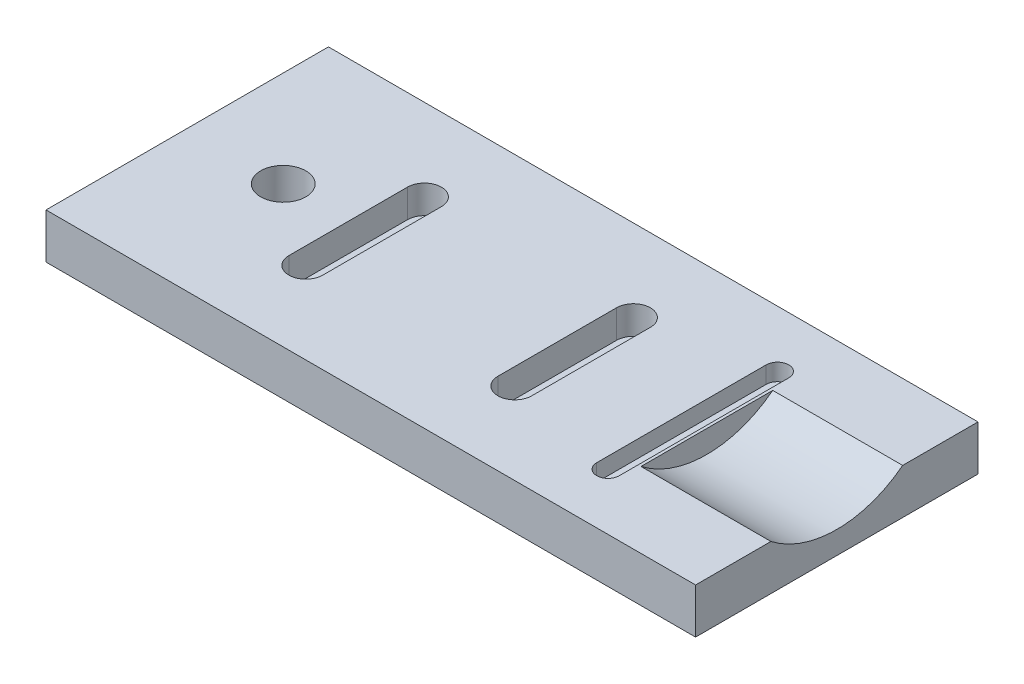
ISO-10303-21;
HEADER;
FILE_DESCRIPTION(('STEP AP214'),'2;1');
FILE_NAME('part.step','',(''),(''),'','','');
FILE_SCHEMA(('AUTOMOTIVE_DESIGN { 1 0 10303 214 1 1 1 1 }'));
ENDSEC;
DATA;
#1=APPLICATION_CONTEXT('core data for automotive mechanical design processes');
#2=APPLICATION_PROTOCOL_DEFINITION('international standard','automotive_design',2000,#1);
#3=PRODUCT_CONTEXT('',#1,'mechanical');
#4=PRODUCT('Part','Part','',(#3));
#5=PRODUCT_RELATED_PRODUCT_CATEGORY('part','',(#4));
#6=PRODUCT_DEFINITION_FORMATION('','',#4);
#7=PRODUCT_DEFINITION_CONTEXT('part definition',#1,'design');
#8=PRODUCT_DEFINITION('design','',#6,#7);
#9=PRODUCT_DEFINITION_SHAPE('','',#8);
#10=(LENGTH_UNIT() NAMED_UNIT(*) SI_UNIT(.MILLI.,.METRE.));
#11=(NAMED_UNIT(*) PLANE_ANGLE_UNIT() SI_UNIT($,.RADIAN.));
#12=(NAMED_UNIT(*) SI_UNIT($,.STERADIAN.) SOLID_ANGLE_UNIT());
#13=UNCERTAINTY_MEASURE_WITH_UNIT(LENGTH_MEASURE(1.E-05),#10,'distance_accuracy_value','');
#14=(GEOMETRIC_REPRESENTATION_CONTEXT(3) GLOBAL_UNCERTAINTY_ASSIGNED_CONTEXT((#13)) GLOBAL_UNIT_ASSIGNED_CONTEXT((#10,
#11,#12)) REPRESENTATION_CONTEXT('',''));
#15=CARTESIAN_POINT('',(0.,0.,0.));
#16=DIRECTION('',(0.,0.,1.));
#17=DIRECTION('',(1.,0.,0.));
#18=AXIS2_PLACEMENT_3D('',#15,#16,#17);
#19=CARTESIAN_POINT('',(57.5,8.,25.));
#20=DIRECTION('',(-1.,0.,0.));
#21=DIRECTION('',(0.,0.,1.));
#22=AXIS2_PLACEMENT_3D('',#19,#20,#21);
#23=PLANE('',#22);
#24=DIRECTION('',(0.,0.,-1.));
#25=VECTOR('',#24,1.);
#26=CARTESIAN_POINT('',(57.5,8.,25.));
#27=LINE('',#26,#25);
#28=CARTESIAN_POINT('',(57.5,8.,-11.6619037896906));
#29=VERTEX_POINT('',#28);
#30=CARTESIAN_POINT('',(57.5,8.,-25.));
#31=VERTEX_POINT('',#30);
#32=EDGE_CURVE('E442',#29,#31,#27,.T.);
#33=ORIENTED_EDGE('',*,*,#32,.F.);
#34=CARTESIAN_POINT('',(57.5,23.,0.));
#35=DIRECTION('',(1.,0.,0.));
#36=DIRECTION('',(0.,0.,-1.));
#37=AXIS2_PLACEMENT_3D('',#34,#35,#36);
#38=CIRCLE('',#37,19.);
#39=CARTESIAN_POINT('',(57.5,8.00000000000001,11.6619037896906));
#40=VERTEX_POINT('',#39);
#41=EDGE_CURVE('E316',#40,#29,#38,.T.);
#42=ORIENTED_EDGE('',*,*,#41,.F.);
#43=CARTESIAN_POINT('',(57.5,8.,25.));
#44=VERTEX_POINT('',#43);
#45=EDGE_CURVE('E438',#44,#40,#27,.T.);
#46=ORIENTED_EDGE('',*,*,#45,.F.);
#47=DIRECTION('',(0.,-1.,0.));
#48=VECTOR('',#47,1.);
#49=CARTESIAN_POINT('',(57.5,8.,25.));
#50=LINE('',#49,#48);
#51=CARTESIAN_POINT('',(57.5,0.,25.));
#52=VERTEX_POINT('',#51);
#53=EDGE_CURVE('E448',#44,#52,#50,.T.);
#54=ORIENTED_EDGE('',*,*,#53,.T.);
#55=DIRECTION('',(0.,0.,-1.));
#56=VECTOR('',#55,1.);
#57=CARTESIAN_POINT('',(57.5,0.,25.));
#58=LINE('',#57,#56);
#59=CARTESIAN_POINT('',(57.5,0.,-25.));
#60=VERTEX_POINT('',#59);
#61=EDGE_CURVE('E449',#52,#60,#58,.T.);
#62=ORIENTED_EDGE('',*,*,#61,.T.);
#63=DIRECTION('',(0.,-1.,0.));
#64=VECTOR('',#63,1.);
#65=CARTESIAN_POINT('',(57.5,8.,-25.));
#66=LINE('',#65,#64);
#67=EDGE_CURVE('E41',#31,#60,#66,.T.);
#68=ORIENTED_EDGE('',*,*,#67,.F.);
#69=EDGE_LOOP('',(#33,#42,#46,#54,#62,#68));
#70=FACE_BOUND('',#69,.T.);
#71=ADVANCED_FACE('F34',(#70),#23,.F.);
#72=CARTESIAN_POINT('',(-57.5,8.,-25.));
#73=DIRECTION('',(0.,0.,1.));
#74=DIRECTION('',(1.,0.,0.));
#75=AXIS2_PLACEMENT_3D('',#72,#73,#74);
#76=PLANE('',#75);
#77=DIRECTION('',(-1.,0.,0.));
#78=VECTOR('',#77,1.);
#79=CARTESIAN_POINT('',(-57.5,0.,-25.));
#80=LINE('',#79,#78);
#81=CARTESIAN_POINT('',(-57.5,0.,-25.));
#82=VERTEX_POINT('',#81);
#83=EDGE_CURVE('E452',#60,#82,#80,.T.);
#84=ORIENTED_EDGE('',*,*,#83,.T.);
#85=DIRECTION('',(0.,-1.,0.));
#86=VECTOR('',#85,1.);
#87=CARTESIAN_POINT('',(-57.5,8.,-25.));
#88=LINE('',#87,#86);
#89=CARTESIAN_POINT('',(-57.5,8.,-25.));
#90=VERTEX_POINT('',#89);
#91=EDGE_CURVE('E463',#90,#82,#88,.T.);
#92=ORIENTED_EDGE('',*,*,#91,.F.);
#93=DIRECTION('',(-1.,0.,0.));
#94=VECTOR('',#93,1.);
#95=CARTESIAN_POINT('',(-57.5,8.,-25.));
#96=LINE('',#95,#94);
#97=EDGE_CURVE('E441',#31,#90,#96,.T.);
#98=ORIENTED_EDGE('',*,*,#97,.F.);
#99=ORIENTED_EDGE('',*,*,#67,.T.);
#100=EDGE_LOOP('',(#84,#92,#98,#99));
#101=FACE_BOUND('',#100,.T.);
#102=ADVANCED_FACE('F498',(#101),#76,.F.);
#103=CARTESIAN_POINT('',(-57.5,8.,25.));
#104=DIRECTION('',(1.,0.,0.));
#105=DIRECTION('',(0.,0.,-1.));
#106=AXIS2_PLACEMENT_3D('',#103,#104,#105);
#107=PLANE('',#106);
#108=DIRECTION('',(0.,0.,1.));
#109=VECTOR('',#108,1.);
#110=CARTESIAN_POINT('',(-57.5,0.,25.));
#111=LINE('',#110,#109);
#112=CARTESIAN_POINT('',(-57.5,0.,25.));
#113=VERTEX_POINT('',#112);
#114=EDGE_CURVE('E454',#82,#113,#111,.T.);
#115=ORIENTED_EDGE('',*,*,#114,.T.);
#116=DIRECTION('',(0.,-1.,0.));
#117=VECTOR('',#116,1.);
#118=CARTESIAN_POINT('',(-57.5,8.,25.));
#119=LINE('',#118,#117);
#120=CARTESIAN_POINT('',(-57.5,8.,25.));
#121=VERTEX_POINT('',#120);
#122=EDGE_CURVE('E460',#121,#113,#119,.T.);
#123=ORIENTED_EDGE('',*,*,#122,.F.);
#124=DIRECTION('',(0.,0.,1.));
#125=VECTOR('',#124,1.);
#126=CARTESIAN_POINT('',(-57.5,8.,25.));
#127=LINE('',#126,#125);
#128=EDGE_CURVE('E444',#90,#121,#127,.T.);
#129=ORIENTED_EDGE('',*,*,#128,.F.);
#130=ORIENTED_EDGE('',*,*,#91,.T.);
#131=EDGE_LOOP('',(#115,#123,#129,#130));
#132=FACE_BOUND('',#131,.T.);
#133=ADVANCED_FACE('F494',(#132),#107,.F.);
#134=CARTESIAN_POINT('',(-57.5,8.,25.));
#135=DIRECTION('',(0.,0.,-1.));
#136=DIRECTION('',(-1.,0.,0.));
#137=AXIS2_PLACEMENT_3D('',#134,#135,#136);
#138=PLANE('',#137);
#139=DIRECTION('',(1.,0.,0.));
#140=VECTOR('',#139,1.);
#141=CARTESIAN_POINT('',(-57.5,0.,25.));
#142=LINE('',#141,#140);
#143=EDGE_CURVE('E456',#113,#52,#142,.T.);
#144=ORIENTED_EDGE('',*,*,#143,.T.);
#145=ORIENTED_EDGE('',*,*,#53,.F.);
#146=DIRECTION('',(1.,0.,0.));
#147=VECTOR('',#146,1.);
#148=CARTESIAN_POINT('',(-57.5,8.,25.));
#149=LINE('',#148,#147);
#150=EDGE_CURVE('E446',#121,#44,#149,.T.);
#151=ORIENTED_EDGE('',*,*,#150,.F.);
#152=ORIENTED_EDGE('',*,*,#122,.T.);
#153=EDGE_LOOP('',(#144,#145,#151,#152));
#154=FACE_BOUND('',#153,.T.);
#155=ADVANCED_FACE('F490',(#154),#138,.F.);
#156=CARTESIAN_POINT('',(0.,8.,0.));
#157=DIRECTION('',(0.,-1.,0.));
#158=DIRECTION('',(0.,0.,-1.));
#159=AXIS2_PLACEMENT_3D('',#156,#157,#158);
#160=PLANE('',#159);
#161=DIRECTION('',(0.,0.,1.));
#162=VECTOR('',#161,1.);
#163=CARTESIAN_POINT('',(30.,8.,-15.));
#164=LINE('',#163,#162);
#165=CARTESIAN_POINT('',(30.,8.,-15.));
#166=VERTEX_POINT('',#165);
#167=CARTESIAN_POINT('',(30.,8.,15.));
#168=VERTEX_POINT('',#167);
#169=EDGE_CURVE('E354',#166,#168,#164,.T.);
#170=ORIENTED_EDGE('',*,*,#169,.F.);
#171=CARTESIAN_POINT('',(32.,8.,-15.));
#172=DIRECTION('',(0.,1.,0.));
#173=DIRECTION('',(0.,0.,1.));
#174=AXIS2_PLACEMENT_3D('',#171,#172,#173);
#175=CIRCLE('',#174,2.);
#176=CARTESIAN_POINT('',(34.,8.,-15.));
#177=VERTEX_POINT('',#176);
#178=EDGE_CURVE('E337',#177,#166,#175,.T.);
#179=ORIENTED_EDGE('',*,*,#178,.F.);
#180=DIRECTION('',(0.,0.,-1.));
#181=VECTOR('',#180,1.);
#182=CARTESIAN_POINT('',(34.,8.,-15.));
#183=LINE('',#182,#181);
#184=CARTESIAN_POINT('',(34.,8.,15.));
#185=VERTEX_POINT('',#184);
#186=EDGE_CURVE('E343',#185,#177,#183,.T.);
#187=ORIENTED_EDGE('',*,*,#186,.F.);
#188=CARTESIAN_POINT('',(32.,8.,15.));
#189=DIRECTION('',(0.,1.,0.));
#190=DIRECTION('',(0.,0.,1.));
#191=AXIS2_PLACEMENT_3D('',#188,#189,#190);
#192=CIRCLE('',#191,2.);
#193=EDGE_CURVE('E357',#168,#185,#192,.T.);
#194=ORIENTED_EDGE('',*,*,#193,.F.);
#195=EDGE_LOOP('',(#170,#179,#187,#194));
#196=FACE_BOUND('',#195,.T.);
#197=DIRECTION('',(0.,0.,1.));
#198=VECTOR('',#197,1.);
#199=CARTESIAN_POINT('',(7.99999999999999,8.,10.5));
#200=LINE('',#199,#198);
#201=CARTESIAN_POINT('',(7.99999999999999,8.,-10.5));
#202=VERTEX_POINT('',#201);
#203=CARTESIAN_POINT('',(7.99999999999999,8.,10.5));
#204=VERTEX_POINT('',#203);
#205=EDGE_CURVE('E386',#202,#204,#200,.T.);
#206=ORIENTED_EDGE('',*,*,#205,.F.);
#207=CARTESIAN_POINT('',(11.,8.,-10.5));
#208=DIRECTION('',(0.,1.,0.));
#209=DIRECTION('',(0.,0.,-1.));
#210=AXIS2_PLACEMENT_3D('',#207,#208,#209);
#211=CIRCLE('',#210,3.);
#212=CARTESIAN_POINT('',(14.,8.,-10.5));
#213=VERTEX_POINT('',#212);
#214=EDGE_CURVE('E364',#213,#202,#211,.T.);
#215=ORIENTED_EDGE('',*,*,#214,.F.);
#216=DIRECTION('',(0.,0.,-1.));
#217=VECTOR('',#216,1.);
#218=CARTESIAN_POINT('',(14.,8.,10.5));
#219=LINE('',#218,#217);
#220=CARTESIAN_POINT('',(14.,8.,10.5));
#221=VERTEX_POINT('',#220);
#222=EDGE_CURVE('E375',#221,#213,#219,.T.);
#223=ORIENTED_EDGE('',*,*,#222,.F.);
#224=CARTESIAN_POINT('',(11.,8.,10.5));
#225=DIRECTION('',(0.,1.,0.));
#226=DIRECTION('',(0.,0.,1.));
#227=AXIS2_PLACEMENT_3D('',#224,#225,#226);
#228=CIRCLE('',#227,3.);
#229=EDGE_CURVE('E389',#204,#221,#228,.T.);
#230=ORIENTED_EDGE('',*,*,#229,.F.);
#231=EDGE_LOOP('',(#206,#215,#223,#230));
#232=FACE_BOUND('',#231,.T.);
#233=DIRECTION('',(0.,0.,1.));
#234=VECTOR('',#233,1.);
#235=CARTESIAN_POINT('',(-29.,8.,10.5));
#236=LINE('',#235,#234);
#237=CARTESIAN_POINT('',(-29.,8.,-10.5));
#238=VERTEX_POINT('',#237);
#239=CARTESIAN_POINT('',(-29.,8.,10.5));
#240=VERTEX_POINT('',#239);
#241=EDGE_CURVE('E418',#238,#240,#236,.T.);
#242=ORIENTED_EDGE('',*,*,#241,.F.);
#243=CARTESIAN_POINT('',(-26.,8.,-10.5));
#244=DIRECTION('',(0.,1.,0.));
#245=DIRECTION('',(0.,0.,-1.));
#246=AXIS2_PLACEMENT_3D('',#243,#244,#245);
#247=CIRCLE('',#246,3.);
#248=CARTESIAN_POINT('',(-23.,8.,-10.5));
#249=VERTEX_POINT('',#248);
#250=EDGE_CURVE('E396',#249,#238,#247,.T.);
#251=ORIENTED_EDGE('',*,*,#250,.F.);
#252=DIRECTION('',(0.,0.,-1.));
#253=VECTOR('',#252,1.);
#254=CARTESIAN_POINT('',(-23.,8.,10.5));
#255=LINE('',#254,#253);
#256=CARTESIAN_POINT('',(-23.,8.,10.5));
#257=VERTEX_POINT('',#256);
#258=EDGE_CURVE('E407',#257,#249,#255,.T.);
#259=ORIENTED_EDGE('',*,*,#258,.F.);
#260=CARTESIAN_POINT('',(-26.,8.,10.5));
#261=DIRECTION('',(0.,1.,0.));
#262=DIRECTION('',(0.,0.,1.));
#263=AXIS2_PLACEMENT_3D('',#260,#261,#262);
#264=CIRCLE('',#263,3.);
#265=EDGE_CURVE('E421',#240,#257,#264,.T.);
#266=ORIENTED_EDGE('',*,*,#265,.F.);
#267=EDGE_LOOP('',(#242,#251,#259,#266));
#268=FACE_BOUND('',#267,.T.);
#269=CARTESIAN_POINT('',(-40.5,8.,0.));
#270=DIRECTION('',(0.,1.,0.));
#271=DIRECTION('',(0.,0.,1.));
#272=AXIS2_PLACEMENT_3D('',#269,#270,#271);
#273=CIRCLE('',#272,4.00000000000001);
#274=CARTESIAN_POINT('',(-40.5,8.,4.00000000000001));
#275=VERTEX_POINT('',#274);
#276=EDGE_CURVE('E428',#275,#275,#273,.T.);
#277=ORIENTED_EDGE('',*,*,#276,.F.);
#278=EDGE_LOOP('',(#277));
#279=FACE_BOUND('',#278,.T.);
#280=DIRECTION('',(0.,0.,1.));
#281=VECTOR('',#280,1.);
#282=CARTESIAN_POINT('',(34.5,8.,0.));
#283=LINE('',#282,#281);
#284=CARTESIAN_POINT('',(34.5,8.,-11.6619037896906));
#285=VERTEX_POINT('',#284);
#286=CARTESIAN_POINT('',(34.5,8.00000000000001,11.6619037896906));
#287=VERTEX_POINT('',#286);
#288=EDGE_CURVE('E11',#285,#287,#283,.T.);
#289=ORIENTED_EDGE('',*,*,#288,.F.);
#290=DIRECTION('',(1.,0.,0.));
#291=VECTOR('',#290,1.);
#292=CARTESIAN_POINT('',(34.5,8.,-11.6619037896906));
#293=LINE('',#292,#291);
#294=EDGE_CURVE('E334',#285,#29,#293,.T.);
#295=ORIENTED_EDGE('',*,*,#294,.T.);
#296=ORIENTED_EDGE('',*,*,#32,.T.);
#297=ORIENTED_EDGE('',*,*,#97,.T.);
#298=ORIENTED_EDGE('',*,*,#128,.T.);
#299=ORIENTED_EDGE('',*,*,#150,.T.);
#300=ORIENTED_EDGE('',*,*,#45,.T.);
#301=DIRECTION('',(1.,0.,0.));
#302=VECTOR('',#301,1.);
#303=CARTESIAN_POINT('',(34.5,8.00000000000001,11.6619037896906));
#304=LINE('',#303,#302);
#305=EDGE_CURVE('E332',#287,#40,#304,.T.);
#306=ORIENTED_EDGE('',*,*,#305,.F.);
#307=EDGE_LOOP('',(#289,#295,#296,#297,#298,#299,#300,#306));
#308=FACE_BOUND('',#307,.T.);
#309=ADVANCED_FACE('F476',(#196,#232,#268,#279,#308),#160,.F.);
#310=CARTESIAN_POINT('',(0.,0.,0.));
#311=DIRECTION('',(0.,-1.,0.));
#312=DIRECTION('',(0.,0.,-1.));
#313=AXIS2_PLACEMENT_3D('',#310,#311,#312);
#314=PLANE('',#313);
#315=CARTESIAN_POINT('',(0.985281374238635,0.,8.48528137423849));
#316=DIRECTION('',(0.,-1.,0.));
#317=DIRECTION('',(0.,0.,-1.));
#318=AXIS2_PLACEMENT_3D('',#315,#316,#317);
#319=CIRCLE('',#318,2.);
#320=CARTESIAN_POINT('',(-0.428932188134473,0.,7.07106781186541));
#321=VERTEX_POINT('',#320);
#322=CARTESIAN_POINT('',(2.39949493661174,0.,9.89949493661157));
#323=VERTEX_POINT('',#322);
#324=EDGE_CURVE('E48',#321,#323,#319,.T.);
#325=ORIENTED_EDGE('',*,*,#324,.F.);
#326=CARTESIAN_POINT('',(-7.50000000000001,0.,0.));
#327=DIRECTION('',(0.,1.,0.));
#328=DIRECTION('',(0.,0.,-1.));
#329=AXIS2_PLACEMENT_3D('',#326,#327,#328);
#330=CIRCLE('',#329,10.);
#331=CARTESIAN_POINT('',(-7.50000000000001,0.,-10.));
#332=VERTEX_POINT('',#331);
#333=EDGE_CURVE('E249',#332,#321,#330,.T.);
#334=ORIENTED_EDGE('',*,*,#333,.F.);
#335=CARTESIAN_POINT('',(-7.50000000000001,0.,-12.));
#336=DIRECTION('',(0.,-1.,0.));
#337=DIRECTION('',(0.,0.,-1.));
#338=AXIS2_PLACEMENT_3D('',#335,#336,#337);
#339=CIRCLE('',#338,2.);
#340=CARTESIAN_POINT('',(-7.50000000000001,0.,-14.));
#341=VERTEX_POINT('',#340);
#342=EDGE_CURVE('E252',#341,#332,#339,.T.);
#343=ORIENTED_EDGE('',*,*,#342,.F.);
#344=CARTESIAN_POINT('',(-7.50000000000001,0.,0.));
#345=DIRECTION('',(0.,-1.,0.));
#346=DIRECTION('',(0.,0.,-1.));
#347=AXIS2_PLACEMENT_3D('',#344,#345,#346);
#348=CIRCLE('',#347,14.);
#349=EDGE_CURVE('E258',#323,#341,#348,.T.);
#350=ORIENTED_EDGE('',*,*,#349,.F.);
#351=EDGE_LOOP('',(#325,#334,#343,#350));
#352=FACE_BOUND('',#351,.T.);
#353=CARTESIAN_POINT('',(-9.36613448086307,0.,-1.86613448086306));
#354=DIRECTION('',(0.,-1.,0.));
#355=DIRECTION('',(0.,0.,-1.));
#356=AXIS2_PLACEMENT_3D('',#353,#354,#355);
#357=CIRCLE('',#356,1.5);
#358=CARTESIAN_POINT('',(-10.75,0.,-1.2874150108745));
#359=VERTEX_POINT('',#358);
#360=CARTESIAN_POINT('',(-8.78741501087451,0.,-3.25));
#361=VERTEX_POINT('',#360);
#362=EDGE_CURVE('E56',#359,#361,#357,.T.);
#363=ORIENTED_EDGE('',*,*,#362,.F.);
#364=DIRECTION('',(0.,0.,-1.));
#365=VECTOR('',#364,1.);
#366=CARTESIAN_POINT('',(-10.75,0.,1.2874150108745));
#367=LINE('',#366,#365);
#368=CARTESIAN_POINT('',(-10.75,0.,1.2874150108745));
#369=VERTEX_POINT('',#368);
#370=EDGE_CURVE('E271',#369,#359,#367,.T.);
#371=ORIENTED_EDGE('',*,*,#370,.F.);
#372=CARTESIAN_POINT('',(-9.36613448086307,0.,1.86613448086305));
#373=DIRECTION('',(0.,-1.,0.));
#374=DIRECTION('',(0.,0.,-1.));
#375=AXIS2_PLACEMENT_3D('',#372,#373,#374);
#376=CIRCLE('',#375,1.5);
#377=CARTESIAN_POINT('',(-8.78741501087451,0.,3.25));
#378=VERTEX_POINT('',#377);
#379=EDGE_CURVE('E309',#378,#369,#376,.T.);
#380=ORIENTED_EDGE('',*,*,#379,.F.);
#381=DIRECTION('',(-1.,0.,0.));
#382=VECTOR('',#381,1.);
#383=CARTESIAN_POINT('',(-8.78741501087451,0.,3.25));
#384=LINE('',#383,#382);
#385=CARTESIAN_POINT('',(-6.21258498912551,0.,3.25));
#386=VERTEX_POINT('',#385);
#387=EDGE_CURVE('E306',#386,#378,#384,.T.);
#388=ORIENTED_EDGE('',*,*,#387,.F.);
#389=CARTESIAN_POINT('',(-5.63386551913696,0.,1.86613448086305));
#390=DIRECTION('',(0.,-1.,0.));
#391=DIRECTION('',(0.,0.,-1.));
#392=AXIS2_PLACEMENT_3D('',#389,#390,#391);
#393=CIRCLE('',#392,1.5);
#394=CARTESIAN_POINT('',(-4.25000000000001,0.,1.2874150108745));
#395=VERTEX_POINT('',#394);
#396=EDGE_CURVE('E303',#395,#386,#393,.T.);
#397=ORIENTED_EDGE('',*,*,#396,.F.);
#398=DIRECTION('',(0.,0.,1.));
#399=VECTOR('',#398,1.);
#400=CARTESIAN_POINT('',(-4.25000000000001,0.,1.2874150108745));
#401=LINE('',#400,#399);
#402=CARTESIAN_POINT('',(-4.25000000000001,0.,-1.2874150108745));
#403=VERTEX_POINT('',#402);
#404=EDGE_CURVE('E300',#403,#395,#401,.T.);
#405=ORIENTED_EDGE('',*,*,#404,.F.);
#406=CARTESIAN_POINT('',(-5.63386551913696,0.,-1.86613448086306));
#407=DIRECTION('',(0.,-1.,0.));
#408=DIRECTION('',(0.,0.,-1.));
#409=AXIS2_PLACEMENT_3D('',#406,#407,#408);
#410=CIRCLE('',#409,1.5);
#411=CARTESIAN_POINT('',(-6.21258498912551,0.,-3.25));
#412=VERTEX_POINT('',#411);
#413=EDGE_CURVE('E297',#412,#403,#410,.T.);
#414=ORIENTED_EDGE('',*,*,#413,.F.);
#415=DIRECTION('',(1.,0.,0.));
#416=VECTOR('',#415,1.);
#417=CARTESIAN_POINT('',(-8.78741501087451,0.,-3.25));
#418=LINE('',#417,#416);
#419=EDGE_CURVE('E294',#361,#412,#418,.T.);
#420=ORIENTED_EDGE('',*,*,#419,.F.);
#421=EDGE_LOOP('',(#363,#371,#380,#388,#397,#405,#414,#420));
#422=FACE_BOUND('',#421,.T.);
#423=CARTESIAN_POINT('',(-40.5,0.,0.));
#424=DIRECTION('',(0.,-1.,0.));
#425=DIRECTION('',(0.,0.,-1.));
#426=AXIS2_PLACEMENT_3D('',#423,#424,#425);
#427=CIRCLE('',#426,4.00000000000001);
#428=CARTESIAN_POINT('',(-40.5,0.,-4.00000000000001));
#429=VERTEX_POINT('',#428);
#430=EDGE_CURVE('E437',#429,#429,#427,.T.);
#431=ORIENTED_EDGE('',*,*,#430,.F.);
#432=EDGE_LOOP('',(#431));
#433=FACE_BOUND('',#432,.T.);
#434=ORIENTED_EDGE('',*,*,#61,.F.);
#435=ORIENTED_EDGE('',*,*,#143,.F.);
#436=ORIENTED_EDGE('',*,*,#114,.F.);
#437=ORIENTED_EDGE('',*,*,#83,.F.);
#438=EDGE_LOOP('',(#434,#435,#436,#437));
#439=FACE_BOUND('',#438,.T.);
#440=ADVANCED_FACE('F473',(#352,#422,#433,#439),#314,.T.);
#441=CARTESIAN_POINT('',(-40.5,-2.,0.));
#442=DIRECTION('',(0.,1.,0.));
#443=DIRECTION('',(0.,0.,1.));
#444=AXIS2_PLACEMENT_3D('',#441,#442,#443);
#445=CYLINDRICAL_SURFACE('',#444,4.00000000000001);
#446=ORIENTED_EDGE('',*,*,#430,.T.);
#447=EDGE_LOOP('',(#446));
#448=FACE_BOUND('',#447,.T.);
#449=ORIENTED_EDGE('',*,*,#276,.T.);
#450=EDGE_LOOP('',(#449));
#451=FACE_BOUND('',#450,.T.);
#452=ADVANCED_FACE('F470',(#448,#451),#445,.F.);
#453=CARTESIAN_POINT('',(-26.,3.,-10.5));
#454=DIRECTION('',(0.,1.,0.));
#455=DIRECTION('',(0.,0.,1.));
#456=AXIS2_PLACEMENT_3D('',#453,#454,#455);
#457=CYLINDRICAL_SURFACE('',#456,3.);
#458=ORIENTED_EDGE('',*,*,#250,.T.);
#459=DIRECTION('',(0.,1.,0.));
#460=VECTOR('',#459,1.);
#461=CARTESIAN_POINT('',(-29.,3.,-10.5));
#462=LINE('',#461,#460);
#463=CARTESIAN_POINT('',(-29.,3.,-10.5));
#464=VERTEX_POINT('',#463);
#465=EDGE_CURVE('E416',#464,#238,#462,.T.);
#466=ORIENTED_EDGE('',*,*,#465,.F.);
#467=CARTESIAN_POINT('',(-26.,3.,-10.5));
#468=DIRECTION('',(0.,1.,0.));
#469=DIRECTION('',(0.,0.,-1.));
#470=AXIS2_PLACEMENT_3D('',#467,#468,#469);
#471=CIRCLE('',#470,3.);
#472=CARTESIAN_POINT('',(-23.,3.,-10.5));
#473=VERTEX_POINT('',#472);
#474=EDGE_CURVE('E403',#473,#464,#471,.T.);
#475=ORIENTED_EDGE('',*,*,#474,.F.);
#476=DIRECTION('',(0.,1.,0.));
#477=VECTOR('',#476,1.);
#478=CARTESIAN_POINT('',(-23.,3.,-10.5));
#479=LINE('',#478,#477);
#480=EDGE_CURVE('E426',#473,#249,#479,.T.);
#481=ORIENTED_EDGE('',*,*,#480,.T.);
#482=EDGE_LOOP('',(#458,#466,#475,#481));
#483=FACE_BOUND('',#482,.T.);
#484=ADVANCED_FACE('F537',(#483),#457,.F.);
#485=CARTESIAN_POINT('',(-23.,3.,10.5));
#486=DIRECTION('',(1.,0.,0.));
#487=DIRECTION('',(0.,0.,-1.));
#488=AXIS2_PLACEMENT_3D('',#485,#486,#487);
#489=PLANE('',#488);
#490=ORIENTED_EDGE('',*,*,#258,.T.);
#491=ORIENTED_EDGE('',*,*,#480,.F.);
#492=DIRECTION('',(0.,0.,-1.));
#493=VECTOR('',#492,1.);
#494=CARTESIAN_POINT('',(-23.,3.,10.5));
#495=LINE('',#494,#493);
#496=CARTESIAN_POINT('',(-23.,3.,10.5));
#497=VERTEX_POINT('',#496);
#498=EDGE_CURVE('E413',#497,#473,#495,.T.);
#499=ORIENTED_EDGE('',*,*,#498,.F.);
#500=DIRECTION('',(0.,1.,0.));
#501=VECTOR('',#500,1.);
#502=CARTESIAN_POINT('',(-23.,3.,10.5));
#503=LINE('',#502,#501);
#504=EDGE_CURVE('E429',#497,#257,#503,.T.);
#505=ORIENTED_EDGE('',*,*,#504,.T.);
#506=EDGE_LOOP('',(#490,#491,#499,#505));
#507=FACE_BOUND('',#506,.T.);
#508=ADVANCED_FACE('F540',(#507),#489,.F.);
#509=CARTESIAN_POINT('',(-26.,3.,10.5));
#510=DIRECTION('',(0.,1.,0.));
#511=DIRECTION('',(0.,0.,1.));
#512=AXIS2_PLACEMENT_3D('',#509,#510,#511);
#513=CYLINDRICAL_SURFACE('',#512,3.);
#514=ORIENTED_EDGE('',*,*,#265,.T.);
#515=ORIENTED_EDGE('',*,*,#504,.F.);
#516=CARTESIAN_POINT('',(-26.,3.,10.5));
#517=DIRECTION('',(0.,1.,0.));
#518=DIRECTION('',(0.,0.,1.));
#519=AXIS2_PLACEMENT_3D('',#516,#517,#518);
#520=CIRCLE('',#519,3.);
#521=CARTESIAN_POINT('',(-29.,3.,10.5));
#522=VERTEX_POINT('',#521);
#523=EDGE_CURVE('E410',#522,#497,#520,.T.);
#524=ORIENTED_EDGE('',*,*,#523,.F.);
#525=DIRECTION('',(0.,1.,0.));
#526=VECTOR('',#525,1.);
#527=CARTESIAN_POINT('',(-29.,3.,10.5));
#528=LINE('',#527,#526);
#529=EDGE_CURVE('E431',#522,#240,#528,.T.);
#530=ORIENTED_EDGE('',*,*,#529,.T.);
#531=EDGE_LOOP('',(#514,#515,#524,#530));
#532=FACE_BOUND('',#531,.T.);
#533=ADVANCED_FACE('F546',(#532),#513,.F.);
#534=CARTESIAN_POINT('',(-29.,3.,10.5));
#535=DIRECTION('',(-1.,0.,0.));
#536=DIRECTION('',(0.,0.,1.));
#537=AXIS2_PLACEMENT_3D('',#534,#535,#536);
#538=PLANE('',#537);
#539=ORIENTED_EDGE('',*,*,#241,.T.);
#540=ORIENTED_EDGE('',*,*,#529,.F.);
#541=DIRECTION('',(0.,0.,1.));
#542=VECTOR('',#541,1.);
#543=CARTESIAN_POINT('',(-29.,3.,10.5));
#544=LINE('',#543,#542);
#545=EDGE_CURVE('E406',#464,#522,#544,.T.);
#546=ORIENTED_EDGE('',*,*,#545,.F.);
#547=ORIENTED_EDGE('',*,*,#465,.T.);
#548=EDGE_LOOP('',(#539,#540,#546,#547));
#549=FACE_BOUND('',#548,.T.);
#550=ADVANCED_FACE('F542',(#549),#538,.F.);
#551=CARTESIAN_POINT('',(-26.,3.,-10.5));
#552=DIRECTION('',(0.,-1.,0.));
#553=DIRECTION('',(0.,0.,-1.));
#554=AXIS2_PLACEMENT_3D('',#551,#552,#553);
#555=PLANE('',#554);
#556=ORIENTED_EDGE('',*,*,#474,.T.);
#557=ORIENTED_EDGE('',*,*,#545,.T.);
#558=ORIENTED_EDGE('',*,*,#523,.T.);
#559=ORIENTED_EDGE('',*,*,#498,.T.);
#560=EDGE_LOOP('',(#556,#557,#558,#559));
#561=FACE_BOUND('',#560,.T.);
#562=ADVANCED_FACE('F545',(#561),#555,.F.);
#563=CARTESIAN_POINT('',(11.,3.,-10.5));
#564=DIRECTION('',(0.,1.,0.));
#565=DIRECTION('',(0.,0.,1.));
#566=AXIS2_PLACEMENT_3D('',#563,#564,#565);
#567=CYLINDRICAL_SURFACE('',#566,3.);
#568=ORIENTED_EDGE('',*,*,#214,.T.);
#569=DIRECTION('',(0.,1.,0.));
#570=VECTOR('',#569,1.);
#571=CARTESIAN_POINT('',(7.99999999999999,3.,-10.5));
#572=LINE('',#571,#570);
#573=CARTESIAN_POINT('',(7.99999999999999,3.,-10.5));
#574=VERTEX_POINT('',#573);
#575=EDGE_CURVE('E384',#574,#202,#572,.T.);
#576=ORIENTED_EDGE('',*,*,#575,.F.);
#577=CARTESIAN_POINT('',(11.,3.,-10.5));
#578=DIRECTION('',(0.,1.,0.));
#579=DIRECTION('',(0.,0.,-1.));
#580=AXIS2_PLACEMENT_3D('',#577,#578,#579);
#581=CIRCLE('',#580,3.);
#582=CARTESIAN_POINT('',(14.,3.,-10.5));
#583=VERTEX_POINT('',#582);
#584=EDGE_CURVE('E371',#583,#574,#581,.T.);
#585=ORIENTED_EDGE('',*,*,#584,.F.);
#586=DIRECTION('',(0.,1.,0.));
#587=VECTOR('',#586,1.);
#588=CARTESIAN_POINT('',(14.,3.,-10.5));
#589=LINE('',#588,#587);
#590=EDGE_CURVE('E394',#583,#213,#589,.T.);
#591=ORIENTED_EDGE('',*,*,#590,.T.);
#592=EDGE_LOOP('',(#568,#576,#585,#591));
#593=FACE_BOUND('',#592,.T.);
#594=ADVANCED_FACE('F556',(#593),#567,.F.);
#595=CARTESIAN_POINT('',(14.,3.,10.5));
#596=DIRECTION('',(1.,0.,0.));
#597=DIRECTION('',(0.,0.,-1.));
#598=AXIS2_PLACEMENT_3D('',#595,#596,#597);
#599=PLANE('',#598);
#600=ORIENTED_EDGE('',*,*,#222,.T.);
#601=ORIENTED_EDGE('',*,*,#590,.F.);
#602=DIRECTION('',(0.,0.,-1.));
#603=VECTOR('',#602,1.);
#604=CARTESIAN_POINT('',(14.,3.,10.5));
#605=LINE('',#604,#603);
#606=CARTESIAN_POINT('',(14.,3.,10.5));
#607=VERTEX_POINT('',#606);
#608=EDGE_CURVE('E381',#607,#583,#605,.T.);
#609=ORIENTED_EDGE('',*,*,#608,.F.);
#610=DIRECTION('',(0.,1.,0.));
#611=VECTOR('',#610,1.);
#612=CARTESIAN_POINT('',(14.,3.,10.5));
#613=LINE('',#612,#611);
#614=EDGE_CURVE('E397',#607,#221,#613,.T.);
#615=ORIENTED_EDGE('',*,*,#614,.T.);
#616=EDGE_LOOP('',(#600,#601,#609,#615));
#617=FACE_BOUND('',#616,.T.);
#618=ADVANCED_FACE('F560',(#617),#599,.F.);
#619=CARTESIAN_POINT('',(11.,3.,10.5));
#620=DIRECTION('',(0.,1.,0.));
#621=DIRECTION('',(0.,0.,1.));
#622=AXIS2_PLACEMENT_3D('',#619,#620,#621);
#623=CYLINDRICAL_SURFACE('',#622,3.);
#624=ORIENTED_EDGE('',*,*,#229,.T.);
#625=ORIENTED_EDGE('',*,*,#614,.F.);
#626=CARTESIAN_POINT('',(11.,3.,10.5));
#627=DIRECTION('',(0.,1.,0.));
#628=DIRECTION('',(0.,0.,1.));
#629=AXIS2_PLACEMENT_3D('',#626,#627,#628);
#630=CIRCLE('',#629,3.);
#631=CARTESIAN_POINT('',(7.99999999999999,3.,10.5));
#632=VERTEX_POINT('',#631);
#633=EDGE_CURVE('E378',#632,#607,#630,.T.);
#634=ORIENTED_EDGE('',*,*,#633,.F.);
#635=DIRECTION('',(0.,1.,0.));
#636=VECTOR('',#635,1.);
#637=CARTESIAN_POINT('',(7.99999999999999,3.,10.5));
#638=LINE('',#637,#636);
#639=EDGE_CURVE('E399',#632,#204,#638,.T.);
#640=ORIENTED_EDGE('',*,*,#639,.T.);
#641=EDGE_LOOP('',(#624,#625,#634,#640));
#642=FACE_BOUND('',#641,.T.);
#643=ADVANCED_FACE('F566',(#642),#623,.F.);
#644=CARTESIAN_POINT('',(7.99999999999999,3.,10.5));
#645=DIRECTION('',(-1.,0.,0.));
#646=DIRECTION('',(0.,0.,1.));
#647=AXIS2_PLACEMENT_3D('',#644,#645,#646);
#648=PLANE('',#647);
#649=ORIENTED_EDGE('',*,*,#205,.T.);
#650=ORIENTED_EDGE('',*,*,#639,.F.);
#651=DIRECTION('',(0.,0.,1.));
#652=VECTOR('',#651,1.);
#653=CARTESIAN_POINT('',(7.99999999999999,3.,10.5));
#654=LINE('',#653,#652);
#655=EDGE_CURVE('E374',#574,#632,#654,.T.);
#656=ORIENTED_EDGE('',*,*,#655,.F.);
#657=ORIENTED_EDGE('',*,*,#575,.T.);
#658=EDGE_LOOP('',(#649,#650,#656,#657));
#659=FACE_BOUND('',#658,.T.);
#660=ADVANCED_FACE('F562',(#659),#648,.F.);
#661=CARTESIAN_POINT('',(11.,3.,-10.5));
#662=DIRECTION('',(0.,-1.,0.));
#663=DIRECTION('',(0.,0.,-1.));
#664=AXIS2_PLACEMENT_3D('',#661,#662,#663);
#665=PLANE('',#664);
#666=ORIENTED_EDGE('',*,*,#584,.T.);
#667=ORIENTED_EDGE('',*,*,#655,.T.);
#668=ORIENTED_EDGE('',*,*,#633,.T.);
#669=ORIENTED_EDGE('',*,*,#608,.T.);
#670=EDGE_LOOP('',(#666,#667,#668,#669));
#671=FACE_BOUND('',#670,.T.);
#672=ADVANCED_FACE('F565',(#671),#665,.F.);
#673=CARTESIAN_POINT('',(32.,5.,-15.));
#674=DIRECTION('',(0.,1.,0.));
#675=DIRECTION('',(0.,0.,1.));
#676=AXIS2_PLACEMENT_3D('',#673,#674,#675);
#677=CYLINDRICAL_SURFACE('',#676,2.);
#678=ORIENTED_EDGE('',*,*,#178,.T.);
#679=DIRECTION('',(0.,1.,0.));
#680=VECTOR('',#679,1.);
#681=CARTESIAN_POINT('',(30.,5.,-15.));
#682=LINE('',#681,#680);
#683=CARTESIAN_POINT('',(30.,5.,-15.));
#684=VERTEX_POINT('',#683);
#685=EDGE_CURVE('E352',#684,#166,#682,.T.);
#686=ORIENTED_EDGE('',*,*,#685,.F.);
#687=CARTESIAN_POINT('',(32.,5.,-15.));
#688=DIRECTION('',(0.,1.,0.));
#689=DIRECTION('',(0.,0.,1.));
#690=AXIS2_PLACEMENT_3D('',#687,#688,#689);
#691=CIRCLE('',#690,2.);
#692=CARTESIAN_POINT('',(34.,5.,-15.));
#693=VERTEX_POINT('',#692);
#694=EDGE_CURVE('E339',#693,#684,#691,.T.);
#695=ORIENTED_EDGE('',*,*,#694,.F.);
#696=DIRECTION('',(0.,1.,0.));
#697=VECTOR('',#696,1.);
#698=CARTESIAN_POINT('',(34.,5.,-15.));
#699=LINE('',#698,#697);
#700=EDGE_CURVE('E362',#693,#177,#699,.T.);
#701=ORIENTED_EDGE('',*,*,#700,.T.);
#702=EDGE_LOOP('',(#678,#686,#695,#701));
#703=FACE_BOUND('',#702,.T.);
#704=ADVANCED_FACE('F576',(#703),#677,.F.);
#705=CARTESIAN_POINT('',(34.,5.,-15.));
#706=DIRECTION('',(1.,0.,0.));
#707=DIRECTION('',(0.,0.,-1.));
#708=AXIS2_PLACEMENT_3D('',#705,#706,#707);
#709=PLANE('',#708);
#710=ORIENTED_EDGE('',*,*,#186,.T.);
#711=ORIENTED_EDGE('',*,*,#700,.F.);
#712=DIRECTION('',(0.,0.,-1.));
#713=VECTOR('',#712,1.);
#714=CARTESIAN_POINT('',(34.,5.,-15.));
#715=LINE('',#714,#713);
#716=CARTESIAN_POINT('',(34.,5.,15.));
#717=VERTEX_POINT('',#716);
#718=EDGE_CURVE('E349',#717,#693,#715,.T.);
#719=ORIENTED_EDGE('',*,*,#718,.F.);
#720=DIRECTION('',(0.,1.,0.));
#721=VECTOR('',#720,1.);
#722=CARTESIAN_POINT('',(34.,5.,15.));
#723=LINE('',#722,#721);
#724=EDGE_CURVE('E365',#717,#185,#723,.T.);
#725=ORIENTED_EDGE('',*,*,#724,.T.);
#726=EDGE_LOOP('',(#710,#711,#719,#725));
#727=FACE_BOUND('',#726,.T.);
#728=ADVANCED_FACE('F580',(#727),#709,.F.);
#729=CARTESIAN_POINT('',(32.,5.,15.));
#730=DIRECTION('',(0.,1.,0.));
#731=DIRECTION('',(0.,0.,1.));
#732=AXIS2_PLACEMENT_3D('',#729,#730,#731);
#733=CYLINDRICAL_SURFACE('',#732,2.);
#734=ORIENTED_EDGE('',*,*,#193,.T.);
#735=ORIENTED_EDGE('',*,*,#724,.F.);
#736=CARTESIAN_POINT('',(32.,5.,15.));
#737=DIRECTION('',(0.,1.,0.));
#738=DIRECTION('',(0.,0.,1.));
#739=AXIS2_PLACEMENT_3D('',#736,#737,#738);
#740=CIRCLE('',#739,2.);
#741=CARTESIAN_POINT('',(30.,5.,15.));
#742=VERTEX_POINT('',#741);
#743=EDGE_CURVE('E346',#742,#717,#740,.T.);
#744=ORIENTED_EDGE('',*,*,#743,.F.);
#745=DIRECTION('',(0.,1.,0.));
#746=VECTOR('',#745,1.);
#747=CARTESIAN_POINT('',(30.,5.,15.));
#748=LINE('',#747,#746);
#749=EDGE_CURVE('E367',#742,#168,#748,.T.);
#750=ORIENTED_EDGE('',*,*,#749,.T.);
#751=EDGE_LOOP('',(#734,#735,#744,#750));
#752=FACE_BOUND('',#751,.T.);
#753=ADVANCED_FACE('F584',(#752),#733,.F.);
#754=CARTESIAN_POINT('',(30.,5.,-15.));
#755=DIRECTION('',(-1.,0.,0.));
#756=DIRECTION('',(0.,0.,1.));
#757=AXIS2_PLACEMENT_3D('',#754,#755,#756);
#758=PLANE('',#757);
#759=ORIENTED_EDGE('',*,*,#169,.T.);
#760=ORIENTED_EDGE('',*,*,#749,.F.);
#761=DIRECTION('',(0.,0.,1.));
#762=VECTOR('',#761,1.);
#763=CARTESIAN_POINT('',(30.,5.,-15.));
#764=LINE('',#763,#762);
#765=EDGE_CURVE('E342',#684,#742,#764,.T.);
#766=ORIENTED_EDGE('',*,*,#765,.F.);
#767=ORIENTED_EDGE('',*,*,#685,.T.);
#768=EDGE_LOOP('',(#759,#760,#766,#767));
#769=FACE_BOUND('',#768,.T.);
#770=ADVANCED_FACE('F517',(#769),#758,.F.);
#771=CARTESIAN_POINT('',(32.,5.,-15.));
#772=DIRECTION('',(0.,1.,0.));
#773=DIRECTION('',(0.,0.,1.));
#774=AXIS2_PLACEMENT_3D('',#771,#772,#773);
#775=PLANE('',#774);
#776=ORIENTED_EDGE('',*,*,#694,.T.);
#777=ORIENTED_EDGE('',*,*,#765,.T.);
#778=ORIENTED_EDGE('',*,*,#743,.T.);
#779=ORIENTED_EDGE('',*,*,#718,.T.);
#780=EDGE_LOOP('',(#776,#777,#778,#779));
#781=FACE_BOUND('',#780,.T.);
#782=ADVANCED_FACE('F509',(#781),#775,.T.);
#783=CARTESIAN_POINT('',(34.5,23.,0.));
#784=DIRECTION('',(1.,0.,0.));
#785=DIRECTION('',(0.,0.,-1.));
#786=AXIS2_PLACEMENT_3D('',#783,#784,#785);
#787=PLANE('',#786);
#788=ORIENTED_EDGE('',*,*,#288,.T.);
#789=CARTESIAN_POINT('',(34.5,23.,0.));
#790=DIRECTION('',(1.,0.,0.));
#791=DIRECTION('',(0.,0.,-1.));
#792=AXIS2_PLACEMENT_3D('',#789,#790,#791);
#793=CIRCLE('',#792,19.);
#794=EDGE_CURVE('E330',#287,#285,#793,.T.);
#795=ORIENTED_EDGE('',*,*,#794,.T.);
#796=EDGE_LOOP('',(#788,#795));
#797=FACE_BOUND('',#796,.T.);
#798=ADVANCED_FACE('F507',(#797),#787,.T.);
#799=CARTESIAN_POINT('',(34.5,23.,0.));
#800=DIRECTION('',(1.,0.,0.));
#801=DIRECTION('',(0.,0.,-1.));
#802=AXIS2_PLACEMENT_3D('',#799,#800,#801);
#803=CYLINDRICAL_SURFACE('',#802,19.);
#804=ORIENTED_EDGE('',*,*,#41,.T.);
#805=ORIENTED_EDGE('',*,*,#294,.F.);
#806=ORIENTED_EDGE('',*,*,#794,.F.);
#807=ORIENTED_EDGE('',*,*,#305,.T.);
#808=EDGE_LOOP('',(#804,#805,#806,#807));
#809=FACE_BOUND('',#808,.T.);
#810=ADVANCED_FACE('F505',(#809),#803,.F.);
#811=CARTESIAN_POINT('',(-9.36613448086307,5.,-1.86613448086306));
#812=DIRECTION('',(0.,-1.,0.));
#813=DIRECTION('',(0.,0.,-1.));
#814=AXIS2_PLACEMENT_3D('',#811,#812,#813);
#815=CYLINDRICAL_SURFACE('',#814,1.5);
#816=ORIENTED_EDGE('',*,*,#362,.T.);
#817=DIRECTION('',(0.,-1.,0.));
#818=VECTOR('',#817,1.);
#819=CARTESIAN_POINT('',(-8.78741501087451,5.,-3.25));
#820=LINE('',#819,#818);
#821=CARTESIAN_POINT('',(-8.78741501087451,5.,-3.25));
#822=VERTEX_POINT('',#821);
#823=EDGE_CURVE('E292',#822,#361,#820,.T.);
#824=ORIENTED_EDGE('',*,*,#823,.F.);
#825=CARTESIAN_POINT('',(-9.36613448086307,5.,-1.86613448086306));
#826=DIRECTION('',(0.,-1.,0.));
#827=DIRECTION('',(0.,0.,-1.));
#828=AXIS2_PLACEMENT_3D('',#825,#826,#827);
#829=CIRCLE('',#828,1.5);
#830=CARTESIAN_POINT('',(-10.75,5.,-1.2874150108745));
#831=VERTEX_POINT('',#830);
#832=EDGE_CURVE('E267',#831,#822,#829,.T.);
#833=ORIENTED_EDGE('',*,*,#832,.F.);
#834=DIRECTION('',(0.,-1.,0.));
#835=VECTOR('',#834,1.);
#836=CARTESIAN_POINT('',(-10.75,5.,-1.2874150108745));
#837=LINE('',#836,#835);
#838=EDGE_CURVE('E314',#831,#359,#837,.T.);
#839=ORIENTED_EDGE('',*,*,#838,.T.);
#840=EDGE_LOOP('',(#816,#824,#833,#839));
#841=FACE_BOUND('',#840,.T.);
#842=ADVANCED_FACE('F515',(#841),#815,.F.);
#843=CARTESIAN_POINT('',(-10.75,5.,1.2874150108745));
#844=DIRECTION('',(-1.,0.,0.));
#845=DIRECTION('',(0.,0.,1.));
#846=AXIS2_PLACEMENT_3D('',#843,#844,#845);
#847=PLANE('',#846);
#848=ORIENTED_EDGE('',*,*,#370,.T.);
#849=ORIENTED_EDGE('',*,*,#838,.F.);
#850=DIRECTION('',(0.,0.,-1.));
#851=VECTOR('',#850,1.);
#852=CARTESIAN_POINT('',(-10.75,5.,1.2874150108745));
#853=LINE('',#852,#851);
#854=CARTESIAN_POINT('',(-10.75,5.,1.2874150108745));
#855=VERTEX_POINT('',#854);
#856=EDGE_CURVE('E289',#855,#831,#853,.T.);
#857=ORIENTED_EDGE('',*,*,#856,.F.);
#858=DIRECTION('',(0.,-1.,0.));
#859=VECTOR('',#858,1.);
#860=CARTESIAN_POINT('',(-10.75,5.,1.2874150108745));
#861=LINE('',#860,#859);
#862=EDGE_CURVE('E317',#855,#369,#861,.T.);
#863=ORIENTED_EDGE('',*,*,#862,.T.);
#864=EDGE_LOOP('',(#848,#849,#857,#863));
#865=FACE_BOUND('',#864,.T.);
#866=ADVANCED_FACE('F667',(#865),#847,.F.);
#867=CARTESIAN_POINT('',(-9.36613448086307,5.,1.86613448086305));
#868=DIRECTION('',(0.,-1.,0.));
#869=DIRECTION('',(0.,0.,-1.));
#870=AXIS2_PLACEMENT_3D('',#867,#868,#869);
#871=CYLINDRICAL_SURFACE('',#870,1.5);
#872=ORIENTED_EDGE('',*,*,#379,.T.);
#873=ORIENTED_EDGE('',*,*,#862,.F.);
#874=CARTESIAN_POINT('',(-9.36613448086307,5.,1.86613448086305));
#875=DIRECTION('',(0.,-1.,0.));
#876=DIRECTION('',(0.,0.,-1.));
#877=AXIS2_PLACEMENT_3D('',#874,#875,#876);
#878=CIRCLE('',#877,1.5);
#879=CARTESIAN_POINT('',(-8.78741501087451,5.,3.25));
#880=VERTEX_POINT('',#879);
#881=EDGE_CURVE('E286',#880,#855,#878,.T.);
#882=ORIENTED_EDGE('',*,*,#881,.F.);
#883=DIRECTION('',(0.,-1.,0.));
#884=VECTOR('',#883,1.);
#885=CARTESIAN_POINT('',(-8.78741501087451,5.,3.25));
#886=LINE('',#885,#884);
#887=EDGE_CURVE('E319',#880,#378,#886,.T.);
#888=ORIENTED_EDGE('',*,*,#887,.T.);
#889=EDGE_LOOP('',(#872,#873,#882,#888));
#890=FACE_BOUND('',#889,.T.);
#891=ADVANCED_FACE('F675',(#890),#871,.F.);
#892=CARTESIAN_POINT('',(-8.78741501087451,5.,3.25));
#893=DIRECTION('',(0.,0.,1.));
#894=DIRECTION('',(1.,0.,0.));
#895=AXIS2_PLACEMENT_3D('',#892,#893,#894);
#896=PLANE('',#895);
#897=ORIENTED_EDGE('',*,*,#387,.T.);
#898=ORIENTED_EDGE('',*,*,#887,.F.);
#899=DIRECTION('',(-1.,0.,0.));
#900=VECTOR('',#899,1.);
#901=CARTESIAN_POINT('',(-8.78741501087451,5.,3.25));
#902=LINE('',#901,#900);
#903=CARTESIAN_POINT('',(-6.21258498912551,5.,3.25));
#904=VERTEX_POINT('',#903);
#905=EDGE_CURVE('E283',#904,#880,#902,.T.);
#906=ORIENTED_EDGE('',*,*,#905,.F.);
#907=DIRECTION('',(0.,-1.,0.));
#908=VECTOR('',#907,1.);
#909=CARTESIAN_POINT('',(-6.21258498912551,5.,3.25));
#910=LINE('',#909,#908);
#911=EDGE_CURVE('E321',#904,#386,#910,.T.);
#912=ORIENTED_EDGE('',*,*,#911,.T.);
#913=EDGE_LOOP('',(#897,#898,#906,#912));
#914=FACE_BOUND('',#913,.T.);
#915=ADVANCED_FACE('F685',(#914),#896,.F.);
#916=CARTESIAN_POINT('',(-5.63386551913696,5.,1.86613448086305));
#917=DIRECTION('',(0.,-1.,0.));
#918=DIRECTION('',(0.,0.,-1.));
#919=AXIS2_PLACEMENT_3D('',#916,#917,#918);
#920=CYLINDRICAL_SURFACE('',#919,1.5);
#921=ORIENTED_EDGE('',*,*,#396,.T.);
#922=ORIENTED_EDGE('',*,*,#911,.F.);
#923=CARTESIAN_POINT('',(-5.63386551913696,5.,1.86613448086305));
#924=DIRECTION('',(0.,-1.,0.));
#925=DIRECTION('',(0.,0.,-1.));
#926=AXIS2_PLACEMENT_3D('',#923,#924,#925);
#927=CIRCLE('',#926,1.5);
#928=CARTESIAN_POINT('',(-4.25000000000001,5.,1.2874150108745));
#929=VERTEX_POINT('',#928);
#930=EDGE_CURVE('E280',#929,#904,#927,.T.);
#931=ORIENTED_EDGE('',*,*,#930,.F.);
#932=DIRECTION('',(0.,-1.,0.));
#933=VECTOR('',#932,1.);
#934=CARTESIAN_POINT('',(-4.25000000000001,5.,1.2874150108745));
#935=LINE('',#934,#933);
#936=EDGE_CURVE('E323',#929,#395,#935,.T.);
#937=ORIENTED_EDGE('',*,*,#936,.T.);
#938=EDGE_LOOP('',(#921,#922,#931,#937));
#939=FACE_BOUND('',#938,.T.);
#940=ADVANCED_FACE('F695',(#939),#920,.F.);
#941=CARTESIAN_POINT('',(-4.25000000000001,5.,1.2874150108745));
#942=DIRECTION('',(1.,0.,0.));
#943=DIRECTION('',(0.,0.,-1.));
#944=AXIS2_PLACEMENT_3D('',#941,#942,#943);
#945=PLANE('',#944);
#946=ORIENTED_EDGE('',*,*,#404,.T.);
#947=ORIENTED_EDGE('',*,*,#936,.F.);
#948=DIRECTION('',(0.,0.,1.));
#949=VECTOR('',#948,1.);
#950=CARTESIAN_POINT('',(-4.25000000000001,5.,1.2874150108745));
#951=LINE('',#950,#949);
#952=CARTESIAN_POINT('',(-4.25000000000001,5.,-1.2874150108745));
#953=VERTEX_POINT('',#952);
#954=EDGE_CURVE('E277',#953,#929,#951,.T.);
#955=ORIENTED_EDGE('',*,*,#954,.F.);
#956=DIRECTION('',(0.,-1.,0.));
#957=VECTOR('',#956,1.);
#958=CARTESIAN_POINT('',(-4.25000000000001,5.,-1.2874150108745));
#959=LINE('',#958,#957);
#960=EDGE_CURVE('E325',#953,#403,#959,.T.);
#961=ORIENTED_EDGE('',*,*,#960,.T.);
#962=EDGE_LOOP('',(#946,#947,#955,#961));
#963=FACE_BOUND('',#962,.T.);
#964=ADVANCED_FACE('F705',(#963),#945,.F.);
#965=CARTESIAN_POINT('',(-5.63386551913696,5.,-1.86613448086306));
#966=DIRECTION('',(0.,-1.,0.));
#967=DIRECTION('',(0.,0.,-1.));
#968=AXIS2_PLACEMENT_3D('',#965,#966,#967);
#969=CYLINDRICAL_SURFACE('',#968,1.5);
#970=ORIENTED_EDGE('',*,*,#413,.T.);
#971=ORIENTED_EDGE('',*,*,#960,.F.);
#972=CARTESIAN_POINT('',(-5.63386551913696,5.,-1.86613448086306));
#973=DIRECTION('',(0.,-1.,0.));
#974=DIRECTION('',(0.,0.,-1.));
#975=AXIS2_PLACEMENT_3D('',#972,#973,#974);
#976=CIRCLE('',#975,1.5);
#977=CARTESIAN_POINT('',(-6.21258498912551,5.,-3.25));
#978=VERTEX_POINT('',#977);
#979=EDGE_CURVE('E274',#978,#953,#976,.T.);
#980=ORIENTED_EDGE('',*,*,#979,.F.);
#981=DIRECTION('',(0.,-1.,0.));
#982=VECTOR('',#981,1.);
#983=CARTESIAN_POINT('',(-6.21258498912551,5.,-3.25));
#984=LINE('',#983,#982);
#985=EDGE_CURVE('E327',#978,#412,#984,.T.);
#986=ORIENTED_EDGE('',*,*,#985,.T.);
#987=EDGE_LOOP('',(#970,#971,#980,#986));
#988=FACE_BOUND('',#987,.T.);
#989=ADVANCED_FACE('F715',(#988),#969,.F.);
#990=CARTESIAN_POINT('',(-8.78741501087451,5.,-3.25));
#991=DIRECTION('',(0.,0.,-1.));
#992=DIRECTION('',(-1.,0.,0.));
#993=AXIS2_PLACEMENT_3D('',#990,#991,#992);
#994=PLANE('',#993);
#995=ORIENTED_EDGE('',*,*,#419,.T.);
#996=ORIENTED_EDGE('',*,*,#985,.F.);
#997=DIRECTION('',(1.,0.,0.));
#998=VECTOR('',#997,1.);
#999=CARTESIAN_POINT('',(-8.78741501087451,5.,-3.25));
#1000=LINE('',#999,#998);
#1001=EDGE_CURVE('E270',#822,#978,#1000,.T.);
#1002=ORIENTED_EDGE('',*,*,#1001,.F.);
#1003=ORIENTED_EDGE('',*,*,#823,.T.);
#1004=EDGE_LOOP('',(#995,#996,#1002,#1003));
#1005=FACE_BOUND('',#1004,.T.);
#1006=ADVANCED_FACE('F725',(#1005),#994,.F.);
#1007=CARTESIAN_POINT('',(-9.36613448086307,5.,-1.86613448086306));
#1008=DIRECTION('',(0.,-1.,0.));
#1009=DIRECTION('',(0.,0.,-1.));
#1010=AXIS2_PLACEMENT_3D('',#1007,#1008,#1009);
#1011=PLANE('',#1010);
#1012=ORIENTED_EDGE('',*,*,#832,.T.);
#1013=ORIENTED_EDGE('',*,*,#1001,.T.);
#1014=ORIENTED_EDGE('',*,*,#979,.T.);
#1015=ORIENTED_EDGE('',*,*,#954,.T.);
#1016=ORIENTED_EDGE('',*,*,#930,.T.);
#1017=ORIENTED_EDGE('',*,*,#905,.T.);
#1018=ORIENTED_EDGE('',*,*,#881,.T.);
#1019=ORIENTED_EDGE('',*,*,#856,.T.);
#1020=EDGE_LOOP('',(#1012,#1013,#1014,#1015,#1016,#1017,#1018,#1019));
#1021=FACE_BOUND('',#1020,.T.);
#1022=ADVANCED_FACE('F735',(#1021),#1011,.T.);
#1023=CARTESIAN_POINT('',(0.985281374238635,5.,8.48528137423849));
#1024=DIRECTION('',(0.,-1.,0.));
#1025=DIRECTION('',(0.,0.,-1.));
#1026=AXIS2_PLACEMENT_3D('',#1023,#1024,#1025);
#1027=CYLINDRICAL_SURFACE('',#1026,2.);
#1028=ORIENTED_EDGE('',*,*,#324,.T.);
#1029=DIRECTION('',(0.,-1.,0.));
#1030=VECTOR('',#1029,1.);
#1031=CARTESIAN_POINT('',(2.39949493661174,5.,9.89949493661157));
#1032=LINE('',#1031,#1030);
#1033=CARTESIAN_POINT('',(2.39949493661174,5.,9.89949493661157));
#1034=VERTEX_POINT('',#1033);
#1035=EDGE_CURVE('E227',#1034,#323,#1032,.T.);
#1036=ORIENTED_EDGE('',*,*,#1035,.F.);
#1037=CARTESIAN_POINT('',(0.985281374238635,5.,8.48528137423849));
#1038=DIRECTION('',(0.,-1.,0.));
#1039=DIRECTION('',(0.,0.,-1.));
#1040=AXIS2_PLACEMENT_3D('',#1037,#1038,#1039);
#1041=CIRCLE('',#1040,2.);
#1042=CARTESIAN_POINT('',(-0.428932188134473,5.,7.07106781186541));
#1043=VERTEX_POINT('',#1042);
#1044=EDGE_CURVE('E231',#1043,#1034,#1041,.T.);
#1045=ORIENTED_EDGE('',*,*,#1044,.F.);
#1046=DIRECTION('',(0.,-1.,0.));
#1047=VECTOR('',#1046,1.);
#1048=CARTESIAN_POINT('',(-0.428932188134473,5.,7.07106781186541));
#1049=LINE('',#1048,#1047);
#1050=EDGE_CURVE('E262',#1043,#321,#1049,.T.);
#1051=ORIENTED_EDGE('',*,*,#1050,.T.);
#1052=EDGE_LOOP('',(#1028,#1036,#1045,#1051));
#1053=FACE_BOUND('',#1052,.T.);
#1054=ADVANCED_FACE('F229',(#1053),#1027,.F.);
#1055=CARTESIAN_POINT('',(-7.50000000000001,5.,0.));
#1056=DIRECTION('',(0.,-1.,0.));
#1057=DIRECTION('',(0.,0.,-1.));
#1058=AXIS2_PLACEMENT_3D('',#1055,#1056,#1057);
#1059=CYLINDRICAL_SURFACE('',#1058,10.);
#1060=ORIENTED_EDGE('',*,*,#333,.T.);
#1061=ORIENTED_EDGE('',*,*,#1050,.F.);
#1062=CARTESIAN_POINT('',(-7.50000000000001,5.,0.));
#1063=DIRECTION('',(0.,1.,0.));
#1064=DIRECTION('',(0.,0.,-1.));
#1065=AXIS2_PLACEMENT_3D('',#1062,#1063,#1064);
#1066=CIRCLE('',#1065,10.);
#1067=CARTESIAN_POINT('',(-7.50000000000001,5.,-10.));
#1068=VERTEX_POINT('',#1067);
#1069=EDGE_CURVE('E237',#1068,#1043,#1066,.T.);
#1070=ORIENTED_EDGE('',*,*,#1069,.F.);
#1071=DIRECTION('',(0.,-1.,0.));
#1072=VECTOR('',#1071,1.);
#1073=CARTESIAN_POINT('',(-7.50000000000001,5.,-10.));
#1074=LINE('',#1073,#1072);
#1075=EDGE_CURVE('E264',#1068,#332,#1074,.T.);
#1076=ORIENTED_EDGE('',*,*,#1075,.T.);
#1077=EDGE_LOOP('',(#1060,#1061,#1070,#1076));
#1078=FACE_BOUND('',#1077,.T.);
#1079=ADVANCED_FACE('F760',(#1078),#1059,.T.);
#1080=CARTESIAN_POINT('',(-7.50000000000001,5.,-12.));
#1081=DIRECTION('',(0.,-1.,0.));
#1082=DIRECTION('',(0.,0.,-1.));
#1083=AXIS2_PLACEMENT_3D('',#1080,#1081,#1082);
#1084=CYLINDRICAL_SURFACE('',#1083,2.);
#1085=ORIENTED_EDGE('',*,*,#342,.T.);
#1086=ORIENTED_EDGE('',*,*,#1075,.F.);
#1087=CARTESIAN_POINT('',(-7.50000000000001,5.,-12.));
#1088=DIRECTION('',(0.,-1.,0.));
#1089=DIRECTION('',(0.,0.,-1.));
#1090=AXIS2_PLACEMENT_3D('',#1087,#1088,#1089);
#1091=CIRCLE('',#1090,2.);
#1092=CARTESIAN_POINT('',(-7.50000000000001,5.,-14.));
#1093=VERTEX_POINT('',#1092);
#1094=EDGE_CURVE('E245',#1093,#1068,#1091,.T.);
#1095=ORIENTED_EDGE('',*,*,#1094,.F.);
#1096=DIRECTION('',(0.,-1.,0.));
#1097=VECTOR('',#1096,1.);
#1098=CARTESIAN_POINT('',(-7.50000000000001,5.,-14.));
#1099=LINE('',#1098,#1097);
#1100=EDGE_CURVE('E236',#1093,#341,#1099,.T.);
#1101=ORIENTED_EDGE('',*,*,#1100,.T.);
#1102=EDGE_LOOP('',(#1085,#1086,#1095,#1101));
#1103=FACE_BOUND('',#1102,.T.);
#1104=ADVANCED_FACE('F769',(#1103),#1084,.F.);
#1105=CARTESIAN_POINT('',(-7.50000000000001,5.,0.));
#1106=DIRECTION('',(0.,-1.,0.));
#1107=DIRECTION('',(0.,0.,-1.));
#1108=AXIS2_PLACEMENT_3D('',#1105,#1106,#1107);
#1109=CYLINDRICAL_SURFACE('',#1108,14.);
#1110=ORIENTED_EDGE('',*,*,#349,.T.);
#1111=ORIENTED_EDGE('',*,*,#1100,.F.);
#1112=CARTESIAN_POINT('',(-7.50000000000001,5.,0.));
#1113=DIRECTION('',(0.,-1.,0.));
#1114=DIRECTION('',(0.,0.,-1.));
#1115=AXIS2_PLACEMENT_3D('',#1112,#1113,#1114);
#1116=CIRCLE('',#1115,14.);
#1117=EDGE_CURVE('E240',#1034,#1093,#1116,.T.);
#1118=ORIENTED_EDGE('',*,*,#1117,.F.);
#1119=ORIENTED_EDGE('',*,*,#1035,.T.);
#1120=EDGE_LOOP('',(#1110,#1111,#1118,#1119));
#1121=FACE_BOUND('',#1120,.T.);
#1122=ADVANCED_FACE('F241',(#1121),#1109,.F.);
#1123=CARTESIAN_POINT('',(-3.25735931288069,5.,4.24264068711925));
#1124=DIRECTION('',(0.,-1.,0.));
#1125=DIRECTION('',(0.,0.,-1.));
#1126=AXIS2_PLACEMENT_3D('',#1123,#1124,#1125);
#1127=PLANE('',#1126);
#1128=ORIENTED_EDGE('',*,*,#1044,.T.);
#1129=ORIENTED_EDGE('',*,*,#1117,.T.);
#1130=ORIENTED_EDGE('',*,*,#1094,.T.);
#1131=ORIENTED_EDGE('',*,*,#1069,.T.);
#1132=EDGE_LOOP('',(#1128,#1129,#1130,#1131));
#1133=FACE_BOUND('',#1132,.T.);
#1134=ADVANCED_FACE('F247',(#1133),#1127,.T.);
#1135=CLOSED_SHELL('',(#71,#102,#133,#155,#309,#440,#452,#484,#508,#533,#550,#562,#594,#618,
#643,#660,#672,#704,#728,#753,#770,#782,#798,#810,#842,#866,#891,#915,#940,#964,#989,#1006,
#1022,#1054,#1079,#1104,#1122,#1134));
#1136=MANIFOLD_SOLID_BREP('B2',#1135);
#1137=ADVANCED_BREP_SHAPE_REPRESENTATION('',(#18,#1136),#14);
#1138=SHAPE_DEFINITION_REPRESENTATION(#9,#1137);
ENDSEC;
END-ISO-10303-21;
